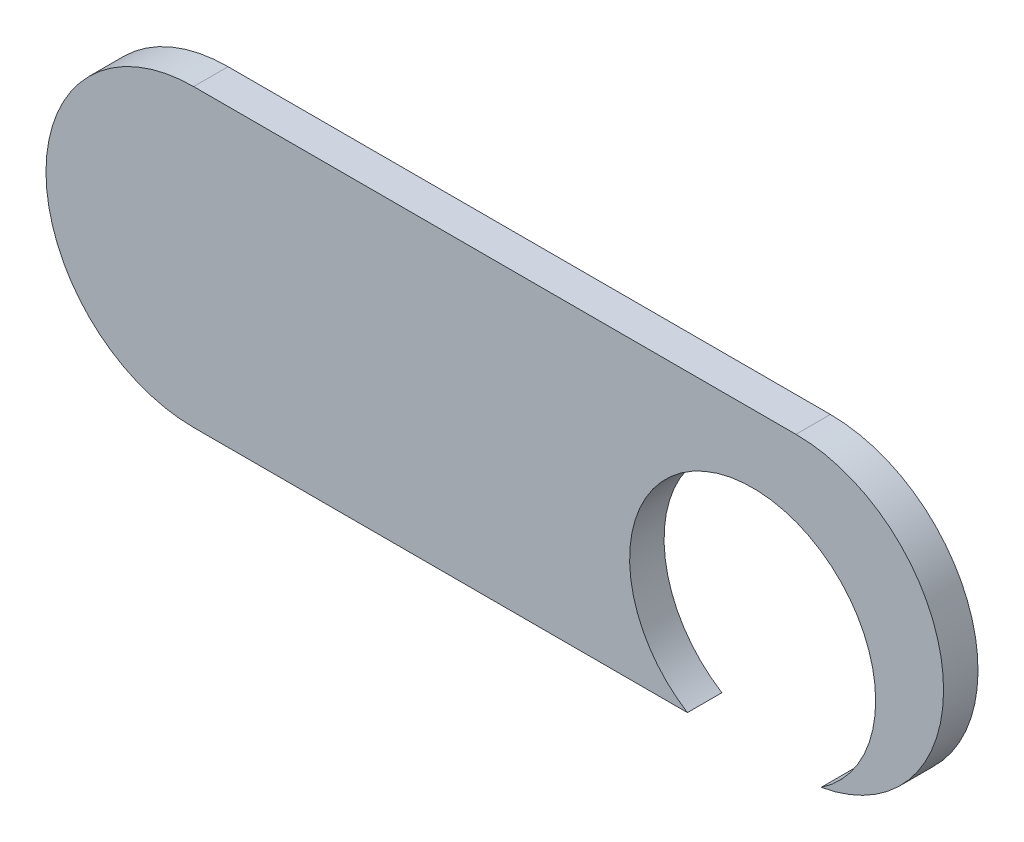
ISO-10303-21;
HEADER;
FILE_DESCRIPTION(('STEP AP214'),'2;1');
FILE_NAME('part.step','',(''),(''),'','','');
FILE_SCHEMA(('AUTOMOTIVE_DESIGN { 1 0 10303 214 1 1 1 1 }'));
ENDSEC;
DATA;
#1=APPLICATION_CONTEXT('core data for automotive mechanical design processes');
#2=APPLICATION_PROTOCOL_DEFINITION('international standard','automotive_design',2000,#1);
#3=PRODUCT_CONTEXT('',#1,'mechanical');
#4=PRODUCT('Part','Part','',(#3));
#5=PRODUCT_RELATED_PRODUCT_CATEGORY('part','',(#4));
#6=PRODUCT_DEFINITION_FORMATION('','',#4);
#7=PRODUCT_DEFINITION_CONTEXT('part definition',#1,'design');
#8=PRODUCT_DEFINITION('design','',#6,#7);
#9=PRODUCT_DEFINITION_SHAPE('','',#8);
#10=(LENGTH_UNIT() NAMED_UNIT(*) SI_UNIT(.MILLI.,.METRE.));
#11=(NAMED_UNIT(*) PLANE_ANGLE_UNIT() SI_UNIT($,.RADIAN.));
#12=(NAMED_UNIT(*) SI_UNIT($,.STERADIAN.) SOLID_ANGLE_UNIT());
#13=UNCERTAINTY_MEASURE_WITH_UNIT(LENGTH_MEASURE(1.E-05),#10,'distance_accuracy_value','');
#14=(GEOMETRIC_REPRESENTATION_CONTEXT(3) GLOBAL_UNCERTAINTY_ASSIGNED_CONTEXT((#13)) GLOBAL_UNIT_ASSIGNED_CONTEXT((#10,
#11,#12)) REPRESENTATION_CONTEXT('',''));
#15=CARTESIAN_POINT('',(0.,0.,0.));
#16=DIRECTION('',(0.,0.,1.));
#17=DIRECTION('',(1.,0.,0.));
#18=AXIS2_PLACEMENT_3D('',#15,#16,#17);
#19=CARTESIAN_POINT('',(131.85,-115.41,1.6));
#20=DIRECTION('',(0.,1.,0.));
#21=DIRECTION('',(1.,0.,0.));
#22=AXIS2_PLACEMENT_3D('',#19,#20,#21);
#23=PLANE('',#22);
#24=DIRECTION('',(0.,0.,-1.));
#25=VECTOR('',#24,1.);
#26=CARTESIAN_POINT('',(132.3517504717,-115.41,-0.045));
#27=LINE('',#26,#25);
#28=CARTESIAN_POINT('',(132.35175047158,-115.41,1.635));
#29=VERTEX_POINT('',#28);
#30=CARTESIAN_POINT('',(132.35175047158,-115.41,1.6));
#31=VERTEX_POINT('',#30);
#32=EDGE_CURVE('E11',#29,#31,#27,.T.);
#33=ORIENTED_EDGE('',*,*,#32,.F.);
#34=DIRECTION('',(1.,0.,0.));
#35=VECTOR('',#34,1.);
#36=CARTESIAN_POINT('',(131.85,-115.41,1.635));
#37=LINE('',#36,#35);
#38=CARTESIAN_POINT('',(131.85,-115.41,1.635));
#39=VERTEX_POINT('',#38);
#40=EDGE_CURVE('E120',#39,#29,#37,.T.);
#41=ORIENTED_EDGE('',*,*,#40,.F.);
#42=DIRECTION('',(0.,0.,1.));
#43=VECTOR('',#42,1.);
#44=CARTESIAN_POINT('',(131.85,-115.41,1.6));
#45=LINE('',#44,#43);
#46=CARTESIAN_POINT('',(131.85,-115.41,1.6));
#47=VERTEX_POINT('',#46);
#48=EDGE_CURVE('E124',#47,#39,#45,.T.);
#49=ORIENTED_EDGE('',*,*,#48,.F.);
#50=DIRECTION('',(1.,0.,0.));
#51=VECTOR('',#50,1.);
#52=CARTESIAN_POINT('',(131.85,-115.41,1.6));
#53=LINE('',#52,#51);
#54=EDGE_CURVE('E117',#47,#31,#53,.T.);
#55=ORIENTED_EDGE('',*,*,#54,.T.);
#56=EDGE_LOOP('',(#33,#41,#49,#55));
#57=FACE_BOUND('',#56,.T.);
#58=ADVANCED_FACE('F17',(#57),#23,.F.);
#59=CARTESIAN_POINT('',(132.418,-115.304,-0.045));
#60=DIRECTION('',(0.,0.,-1.));
#61=DIRECTION('',(0.,-1.,0.));
#62=AXIS2_PLACEMENT_3D('',#59,#60,#61);
#63=CYLINDRICAL_SURFACE('',#62,0.125);
#64=CARTESIAN_POINT('',(132.418,-115.304,1.635));
#65=DIRECTION('',(0.,0.,-1.));
#66=DIRECTION('',(0.,-1.,0.));
#67=AXIS2_PLACEMENT_3D('',#64,#65,#66);
#68=CIRCLE('',#67,0.125);
#69=CARTESIAN_POINT('',(132.48766333873,-115.4077883386,1.635));
#70=VERTEX_POINT('',#69);
#71=EDGE_CURVE('E27',#29,#70,#68,.T.);
#72=ORIENTED_EDGE('',*,*,#71,.F.);
#73=ORIENTED_EDGE('',*,*,#32,.T.);
#74=CARTESIAN_POINT('',(132.418,-115.304,1.6));
#75=DIRECTION('',(0.,0.,-1.));
#76=DIRECTION('',(0.,-1.,0.));
#77=AXIS2_PLACEMENT_3D('',#74,#75,#76);
#78=CIRCLE('',#77,0.125);
#79=CARTESIAN_POINT('',(132.48766333873,-115.4077883386,1.6));
#80=VERTEX_POINT('',#79);
#81=EDGE_CURVE('E121',#31,#80,#78,.T.);
#82=ORIENTED_EDGE('',*,*,#81,.T.);
#83=DIRECTION('',(0.,0.,-1.));
#84=VECTOR('',#83,1.);
#85=CARTESIAN_POINT('',(132.48766333867,-115.4077883386,1.6));
#86=LINE('',#85,#84);
#87=EDGE_CURVE('E81',#70,#80,#86,.T.);
#88=ORIENTED_EDGE('',*,*,#87,.F.);
#89=EDGE_LOOP('',(#72,#73,#82,#88));
#90=FACE_BOUND('',#89,.T.);
#91=ADVANCED_FACE('F19',(#90),#63,.F.);
#92=CARTESIAN_POINT('',(132.462,-115.11,1.635));
#93=DIRECTION('',(0.,0.,1.));
#94=DIRECTION('',(1.,0.,0.));
#95=AXIS2_PLACEMENT_3D('',#92,#93,#94);
#96=PLANE('',#95);
#97=CARTESIAN_POINT('',(132.462,-115.26,1.635));
#98=DIRECTION('',(0.,0.,1.));
#99=DIRECTION('',(0.,-1.,0.));
#100=AXIS2_PLACEMENT_3D('',#97,#98,#99);
#101=CIRCLE('',#100,0.15);
#102=CARTESIAN_POINT('',(132.462,-115.11,1.635));
#103=VERTEX_POINT('',#102);
#104=EDGE_CURVE('E96',#70,#103,#101,.T.);
#105=ORIENTED_EDGE('',*,*,#104,.T.);
#106=DIRECTION('',(-1.,0.,0.));
#107=VECTOR('',#106,1.);
#108=CARTESIAN_POINT('',(132.462,-115.11,1.635));
#109=LINE('',#108,#107);
#110=CARTESIAN_POINT('',(131.85,-115.11,1.635));
#111=VERTEX_POINT('',#110);
#112=EDGE_CURVE('E94',#103,#111,#109,.T.);
#113=ORIENTED_EDGE('',*,*,#112,.T.);
#114=CARTESIAN_POINT('',(131.85,-115.26,1.635));
#115=DIRECTION('',(0.,0.,1.));
#116=DIRECTION('',(1.894780628694E-13,1.,0.));
#117=AXIS2_PLACEMENT_3D('',#114,#115,#116);
#118=CIRCLE('',#117,0.15);
#119=EDGE_CURVE('E128',#111,#39,#118,.T.);
#120=ORIENTED_EDGE('',*,*,#119,.T.);
#121=ORIENTED_EDGE('',*,*,#40,.T.);
#122=ORIENTED_EDGE('',*,*,#71,.T.);
#123=EDGE_LOOP('',(#105,#113,#120,#121,#122));
#124=FACE_BOUND('',#123,.T.);
#125=ADVANCED_FACE('F143',(#124),#96,.T.);
#126=CARTESIAN_POINT('',(132.462,-115.11,1.6));
#127=DIRECTION('',(0.,0.,1.));
#128=DIRECTION('',(1.,0.,0.));
#129=AXIS2_PLACEMENT_3D('',#126,#127,#128);
#130=PLANE('',#129);
#131=ORIENTED_EDGE('',*,*,#81,.F.);
#132=ORIENTED_EDGE('',*,*,#54,.F.);
#133=CARTESIAN_POINT('',(131.85,-115.26,1.6));
#134=DIRECTION('',(0.,0.,1.));
#135=DIRECTION('',(1.894780628694E-13,1.,0.));
#136=AXIS2_PLACEMENT_3D('',#133,#134,#135);
#137=CIRCLE('',#136,0.15);
#138=CARTESIAN_POINT('',(131.85,-115.11,1.6));
#139=VERTEX_POINT('',#138);
#140=EDGE_CURVE('E86',#139,#47,#137,.T.);
#141=ORIENTED_EDGE('',*,*,#140,.F.);
#142=DIRECTION('',(-1.,0.,0.));
#143=VECTOR('',#142,1.);
#144=CARTESIAN_POINT('',(132.462,-115.11,1.6));
#145=LINE('',#144,#143);
#146=CARTESIAN_POINT('',(132.462,-115.11,1.6));
#147=VERTEX_POINT('',#146);
#148=EDGE_CURVE('E92',#147,#139,#145,.T.);
#149=ORIENTED_EDGE('',*,*,#148,.F.);
#150=CARTESIAN_POINT('',(132.462,-115.26,1.6));
#151=DIRECTION('',(0.,0.,1.));
#152=DIRECTION('',(0.,-1.,0.));
#153=AXIS2_PLACEMENT_3D('',#150,#151,#152);
#154=CIRCLE('',#153,0.15);
#155=EDGE_CURVE('E74',#80,#147,#154,.T.);
#156=ORIENTED_EDGE('',*,*,#155,.F.);
#157=EDGE_LOOP('',(#131,#132,#141,#149,#156));
#158=FACE_BOUND('',#157,.T.);
#159=ADVANCED_FACE('F98',(#158),#130,.F.);
#160=CARTESIAN_POINT('',(131.85,-115.26,1.6));
#161=DIRECTION('',(0.,0.,-1.));
#162=DIRECTION('',(1.894780628694E-13,1.,0.));
#163=AXIS2_PLACEMENT_3D('',#160,#161,#162);
#164=CYLINDRICAL_SURFACE('',#163,0.15);
#165=ORIENTED_EDGE('',*,*,#140,.T.);
#166=ORIENTED_EDGE('',*,*,#48,.T.);
#167=ORIENTED_EDGE('',*,*,#119,.F.);
#168=DIRECTION('',(0.,0.,1.));
#169=VECTOR('',#168,1.);
#170=CARTESIAN_POINT('',(131.85,-115.11,1.6));
#171=LINE('',#170,#169);
#172=EDGE_CURVE('E102',#139,#111,#171,.T.);
#173=ORIENTED_EDGE('',*,*,#172,.F.);
#174=EDGE_LOOP('',(#165,#166,#167,#173));
#175=FACE_BOUND('',#174,.T.);
#176=ADVANCED_FACE('F146',(#175),#164,.T.);
#177=CARTESIAN_POINT('',(132.462,-115.26,1.6));
#178=DIRECTION('',(0.,0.,-1.));
#179=DIRECTION('',(0.,-1.,0.));
#180=AXIS2_PLACEMENT_3D('',#177,#178,#179);
#181=CYLINDRICAL_SURFACE('',#180,0.15);
#182=DIRECTION('',(0.,0.,1.));
#183=VECTOR('',#182,1.);
#184=CARTESIAN_POINT('',(132.462,-115.11,1.6));
#185=LINE('',#184,#183);
#186=EDGE_CURVE('E78',#147,#103,#185,.T.);
#187=ORIENTED_EDGE('',*,*,#186,.T.);
#188=ORIENTED_EDGE('',*,*,#104,.F.);
#189=ORIENTED_EDGE('',*,*,#87,.T.);
#190=ORIENTED_EDGE('',*,*,#155,.T.);
#191=EDGE_LOOP('',(#187,#188,#189,#190));
#192=FACE_BOUND('',#191,.T.);
#193=ADVANCED_FACE('F76',(#192),#181,.T.);
#194=CARTESIAN_POINT('',(132.462,-115.11,1.6));
#195=DIRECTION('',(0.,-1.,0.));
#196=DIRECTION('',(0.,0.,-1.));
#197=AXIS2_PLACEMENT_3D('',#194,#195,#196);
#198=PLANE('',#197);
#199=ORIENTED_EDGE('',*,*,#148,.T.);
#200=ORIENTED_EDGE('',*,*,#172,.T.);
#201=ORIENTED_EDGE('',*,*,#112,.F.);
#202=ORIENTED_EDGE('',*,*,#186,.F.);
#203=EDGE_LOOP('',(#199,#200,#201,#202));
#204=FACE_BOUND('',#203,.T.);
#205=ADVANCED_FACE('F90',(#204),#198,.F.);
#206=CLOSED_SHELL('',(#58,#91,#125,#159,#176,#193,#205));
#207=MANIFOLD_SOLID_BREP('B1',#206);
#208=ADVANCED_BREP_SHAPE_REPRESENTATION('',(#18,#207),#14);
#209=SHAPE_DEFINITION_REPRESENTATION(#9,#208);
ENDSEC;
END-ISO-10303-21;
